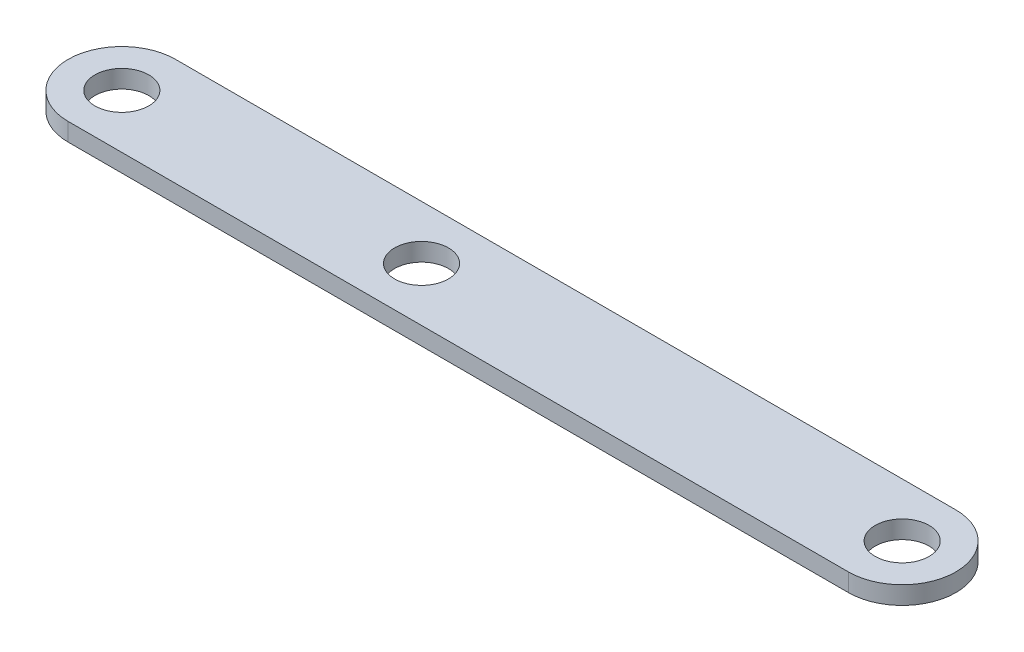
ISO-10303-21;
HEADER;
FILE_DESCRIPTION(('STEP AP214'),'2;1');
FILE_NAME('part.step','',(''),(''),'','','');
FILE_SCHEMA(('AUTOMOTIVE_DESIGN { 1 0 10303 214 1 1 1 1 }'));
ENDSEC;
DATA;
#1=APPLICATION_CONTEXT('core data for automotive mechanical design processes');
#2=APPLICATION_PROTOCOL_DEFINITION('international standard','automotive_design',2000,#1);
#3=PRODUCT_CONTEXT('',#1,'mechanical');
#4=PRODUCT('Part','Part','',(#3));
#5=PRODUCT_RELATED_PRODUCT_CATEGORY('part','',(#4));
#6=PRODUCT_DEFINITION_FORMATION('','',#4);
#7=PRODUCT_DEFINITION_CONTEXT('part definition',#1,'design');
#8=PRODUCT_DEFINITION('design','',#6,#7);
#9=PRODUCT_DEFINITION_SHAPE('','',#8);
#10=(LENGTH_UNIT() NAMED_UNIT(*) SI_UNIT(.MILLI.,.METRE.));
#11=(NAMED_UNIT(*) PLANE_ANGLE_UNIT() SI_UNIT($,.RADIAN.));
#12=(NAMED_UNIT(*) SI_UNIT($,.STERADIAN.) SOLID_ANGLE_UNIT());
#13=UNCERTAINTY_MEASURE_WITH_UNIT(LENGTH_MEASURE(1.E-05),#10,'distance_accuracy_value','');
#14=(GEOMETRIC_REPRESENTATION_CONTEXT(3) GLOBAL_UNCERTAINTY_ASSIGNED_CONTEXT((#13)) GLOBAL_UNIT_ASSIGNED_CONTEXT((#10,
#11,#12)) REPRESENTATION_CONTEXT('',''));
#15=CARTESIAN_POINT('',(0.,0.,0.));
#16=DIRECTION('',(0.,0.,1.));
#17=DIRECTION('',(1.,0.,0.));
#18=AXIS2_PLACEMENT_3D('',#15,#16,#17);
#19=CARTESIAN_POINT('',(0.,3.175,-9.5));
#20=DIRECTION('',(0.,1.,0.));
#21=DIRECTION('',(0.,0.,1.));
#22=AXIS2_PLACEMENT_3D('',#19,#20,#21);
#23=PLANE('',#22);
#24=CARTESIAN_POINT('',(138.,3.175,-9.5));
#25=DIRECTION('',(0.,1.,0.));
#26=DIRECTION('',(0.,0.,1.));
#27=AXIS2_PLACEMENT_3D('',#24,#25,#26);
#28=CIRCLE('',#27,4.76250000000001);
#29=CARTESIAN_POINT('',(138.,3.175,-4.73749999999999));
#30=VERTEX_POINT('',#29);
#31=EDGE_CURVE('E115',#30,#30,#28,.T.);
#32=ORIENTED_EDGE('',*,*,#31,.F.);
#33=EDGE_LOOP('',(#32));
#34=FACE_BOUND('',#33,.T.);
#35=CARTESIAN_POINT('',(0.,3.175,-9.5));
#36=DIRECTION('',(0.,1.,0.));
#37=DIRECTION('',(0.,0.,1.));
#38=AXIS2_PLACEMENT_3D('',#35,#36,#37);
#39=CIRCLE('',#38,9.5);
#40=CARTESIAN_POINT('',(0.,3.175,-19.));
#41=VERTEX_POINT('',#40);
#42=CARTESIAN_POINT('',(0.,3.175,0.));
#43=VERTEX_POINT('',#42);
#44=EDGE_CURVE('E85',#41,#43,#39,.T.);
#45=ORIENTED_EDGE('',*,*,#44,.T.);
#46=DIRECTION('',(1.,0.,0.));
#47=VECTOR('',#46,1.);
#48=CARTESIAN_POINT('',(0.,3.175,0.));
#49=LINE('',#48,#47);
#50=CARTESIAN_POINT('',(138.,3.175,0.));
#51=VERTEX_POINT('',#50);
#52=EDGE_CURVE('E80',#43,#51,#49,.T.);
#53=ORIENTED_EDGE('',*,*,#52,.T.);
#54=CARTESIAN_POINT('',(138.,3.175,-9.5));
#55=DIRECTION('',(0.,1.,0.));
#56=DIRECTION('',(0.,0.,1.));
#57=AXIS2_PLACEMENT_3D('',#54,#55,#56);
#58=CIRCLE('',#57,9.5);
#59=CARTESIAN_POINT('',(138.,3.175,-19.));
#60=VERTEX_POINT('',#59);
#61=EDGE_CURVE('E83',#51,#60,#58,.T.);
#62=ORIENTED_EDGE('',*,*,#61,.T.);
#63=DIRECTION('',(-1.,0.,0.));
#64=VECTOR('',#63,1.);
#65=CARTESIAN_POINT('',(0.,3.175,-19.));
#66=LINE('',#65,#64);
#67=EDGE_CURVE('E50',#60,#41,#66,.T.);
#68=ORIENTED_EDGE('',*,*,#67,.T.);
#69=EDGE_LOOP('',(#45,#53,#62,#68));
#70=FACE_BOUND('',#69,.T.);
#71=CARTESIAN_POINT('',(0.,3.175,-9.5));
#72=DIRECTION('',(0.,1.,0.));
#73=DIRECTION('',(0.,0.,1.));
#74=AXIS2_PLACEMENT_3D('',#71,#72,#73);
#75=CIRCLE('',#74,4.7625);
#76=CARTESIAN_POINT('',(0.,3.175,-4.7375));
#77=VERTEX_POINT('',#76);
#78=EDGE_CURVE('E100',#77,#77,#75,.T.);
#79=ORIENTED_EDGE('',*,*,#78,.F.);
#80=EDGE_LOOP('',(#79));
#81=FACE_BOUND('',#80,.T.);
#82=CARTESIAN_POINT('',(53.,3.175,-9.5));
#83=DIRECTION('',(0.,1.,0.));
#84=DIRECTION('',(0.,0.,1.));
#85=AXIS2_PLACEMENT_3D('',#82,#83,#84);
#86=CIRCLE('',#85,4.7625);
#87=CARTESIAN_POINT('',(53.,3.175,-4.7375));
#88=VERTEX_POINT('',#87);
#89=EDGE_CURVE('E121',#88,#88,#86,.T.);
#90=ORIENTED_EDGE('',*,*,#89,.F.);
#91=EDGE_LOOP('',(#90));
#92=FACE_BOUND('',#91,.T.);
#93=ADVANCED_FACE('F33',(#34,#70,#81,#92),#23,.T.);
#94=CARTESIAN_POINT('',(0.,0.,-9.5));
#95=DIRECTION('',(0.,1.,0.));
#96=DIRECTION('',(0.,0.,1.));
#97=AXIS2_PLACEMENT_3D('',#94,#95,#96);
#98=PLANE('',#97);
#99=CARTESIAN_POINT('',(0.,0.,-9.5));
#100=DIRECTION('',(0.,1.,0.));
#101=DIRECTION('',(0.,0.,1.));
#102=AXIS2_PLACEMENT_3D('',#99,#100,#101);
#103=CIRCLE('',#102,9.5);
#104=CARTESIAN_POINT('',(0.,0.,-19.));
#105=VERTEX_POINT('',#104);
#106=CARTESIAN_POINT('',(0.,0.,0.));
#107=VERTEX_POINT('',#106);
#108=EDGE_CURVE('E97',#105,#107,#103,.T.);
#109=ORIENTED_EDGE('',*,*,#108,.F.);
#110=DIRECTION('',(-1.,0.,0.));
#111=VECTOR('',#110,1.);
#112=CARTESIAN_POINT('',(0.,0.,-19.));
#113=LINE('',#112,#111);
#114=CARTESIAN_POINT('',(138.,0.,-19.));
#115=VERTEX_POINT('',#114);
#116=EDGE_CURVE('E73',#115,#105,#113,.T.);
#117=ORIENTED_EDGE('',*,*,#116,.F.);
#118=CARTESIAN_POINT('',(138.,0.,-9.5));
#119=DIRECTION('',(0.,1.,0.));
#120=DIRECTION('',(0.,0.,1.));
#121=AXIS2_PLACEMENT_3D('',#118,#119,#120);
#122=CIRCLE('',#121,9.5);
#123=CARTESIAN_POINT('',(138.,0.,0.));
#124=VERTEX_POINT('',#123);
#125=EDGE_CURVE('E67',#124,#115,#122,.T.);
#126=ORIENTED_EDGE('',*,*,#125,.F.);
#127=DIRECTION('',(1.,0.,0.));
#128=VECTOR('',#127,1.);
#129=CARTESIAN_POINT('',(0.,0.,0.));
#130=LINE('',#129,#128);
#131=EDGE_CURVE('E89',#107,#124,#130,.T.);
#132=ORIENTED_EDGE('',*,*,#131,.F.);
#133=EDGE_LOOP('',(#109,#117,#126,#132));
#134=FACE_BOUND('',#133,.T.);
#135=CARTESIAN_POINT('',(0.,0.,-9.5));
#136=DIRECTION('',(0.,1.,0.));
#137=DIRECTION('',(0.,0.,1.));
#138=AXIS2_PLACEMENT_3D('',#135,#136,#137);
#139=CIRCLE('',#138,4.7625);
#140=CARTESIAN_POINT('',(0.,0.,-4.7375));
#141=VERTEX_POINT('',#140);
#142=EDGE_CURVE('E112',#141,#141,#139,.T.);
#143=ORIENTED_EDGE('',*,*,#142,.T.);
#144=EDGE_LOOP('',(#143));
#145=FACE_BOUND('',#144,.T.);
#146=CARTESIAN_POINT('',(138.,0.,-9.5));
#147=DIRECTION('',(0.,1.,0.));
#148=DIRECTION('',(0.,0.,1.));
#149=AXIS2_PLACEMENT_3D('',#146,#147,#148);
#150=CIRCLE('',#149,4.76250000000001);
#151=CARTESIAN_POINT('',(138.,0.,-4.73749999999999));
#152=VERTEX_POINT('',#151);
#153=EDGE_CURVE('E118',#152,#152,#150,.T.);
#154=ORIENTED_EDGE('',*,*,#153,.T.);
#155=EDGE_LOOP('',(#154));
#156=FACE_BOUND('',#155,.T.);
#157=CARTESIAN_POINT('',(53.,0.,-9.5));
#158=DIRECTION('',(0.,1.,0.));
#159=DIRECTION('',(0.,0.,1.));
#160=AXIS2_PLACEMENT_3D('',#157,#158,#159);
#161=CIRCLE('',#160,4.7625);
#162=CARTESIAN_POINT('',(53.,0.,-4.7375));
#163=VERTEX_POINT('',#162);
#164=EDGE_CURVE('E124',#163,#163,#161,.T.);
#165=ORIENTED_EDGE('',*,*,#164,.T.);
#166=EDGE_LOOP('',(#165));
#167=FACE_BOUND('',#166,.T.);
#168=ADVANCED_FACE('F108',(#134,#145,#156,#167),#98,.F.);
#169=CARTESIAN_POINT('',(0.,3.175,-9.5));
#170=DIRECTION('',(0.,-1.,0.));
#171=DIRECTION('',(0.,0.,-1.));
#172=AXIS2_PLACEMENT_3D('',#169,#170,#171);
#173=CYLINDRICAL_SURFACE('',#172,9.5);
#174=ORIENTED_EDGE('',*,*,#108,.T.);
#175=DIRECTION('',(0.,-1.,0.));
#176=VECTOR('',#175,1.);
#177=CARTESIAN_POINT('',(0.,3.175,0.));
#178=LINE('',#177,#176);
#179=EDGE_CURVE('E11',#43,#107,#178,.T.);
#180=ORIENTED_EDGE('',*,*,#179,.F.);
#181=ORIENTED_EDGE('',*,*,#44,.F.);
#182=DIRECTION('',(0.,-1.,0.));
#183=VECTOR('',#182,1.);
#184=CARTESIAN_POINT('',(0.,3.175,-19.));
#185=LINE('',#184,#183);
#186=EDGE_CURVE('E93',#41,#105,#185,.T.);
#187=ORIENTED_EDGE('',*,*,#186,.T.);
#188=EDGE_LOOP('',(#174,#180,#181,#187));
#189=FACE_BOUND('',#188,.T.);
#190=ADVANCED_FACE('F35',(#189),#173,.T.);
#191=CARTESIAN_POINT('',(0.,3.175,0.));
#192=DIRECTION('',(0.,0.,-1.));
#193=DIRECTION('',(-1.,0.,0.));
#194=AXIS2_PLACEMENT_3D('',#191,#192,#193);
#195=PLANE('',#194);
#196=ORIENTED_EDGE('',*,*,#131,.T.);
#197=DIRECTION('',(0.,-1.,0.));
#198=VECTOR('',#197,1.);
#199=CARTESIAN_POINT('',(138.,3.175,0.));
#200=LINE('',#199,#198);
#201=EDGE_CURVE('E42',#51,#124,#200,.T.);
#202=ORIENTED_EDGE('',*,*,#201,.F.);
#203=ORIENTED_EDGE('',*,*,#52,.F.);
#204=ORIENTED_EDGE('',*,*,#179,.T.);
#205=EDGE_LOOP('',(#196,#202,#203,#204));
#206=FACE_BOUND('',#205,.T.);
#207=ADVANCED_FACE('F88',(#206),#195,.F.);
#208=CARTESIAN_POINT('',(138.,3.175,-9.5));
#209=DIRECTION('',(0.,-1.,0.));
#210=DIRECTION('',(0.,0.,-1.));
#211=AXIS2_PLACEMENT_3D('',#208,#209,#210);
#212=CYLINDRICAL_SURFACE('',#211,9.5);
#213=ORIENTED_EDGE('',*,*,#125,.T.);
#214=DIRECTION('',(0.,-1.,0.));
#215=VECTOR('',#214,1.);
#216=CARTESIAN_POINT('',(138.,3.175,-19.));
#217=LINE('',#216,#215);
#218=EDGE_CURVE('E90',#60,#115,#217,.T.);
#219=ORIENTED_EDGE('',*,*,#218,.F.);
#220=ORIENTED_EDGE('',*,*,#61,.F.);
#221=ORIENTED_EDGE('',*,*,#201,.T.);
#222=EDGE_LOOP('',(#213,#219,#220,#221));
#223=FACE_BOUND('',#222,.T.);
#224=ADVANCED_FACE('F91',(#223),#212,.T.);
#225=CARTESIAN_POINT('',(0.,3.175,-19.));
#226=DIRECTION('',(0.,0.,1.));
#227=DIRECTION('',(1.,0.,0.));
#228=AXIS2_PLACEMENT_3D('',#225,#226,#227);
#229=PLANE('',#228);
#230=ORIENTED_EDGE('',*,*,#116,.T.);
#231=ORIENTED_EDGE('',*,*,#186,.F.);
#232=ORIENTED_EDGE('',*,*,#67,.F.);
#233=ORIENTED_EDGE('',*,*,#218,.T.);
#234=EDGE_LOOP('',(#230,#231,#232,#233));
#235=FACE_BOUND('',#234,.T.);
#236=ADVANCED_FACE('F105',(#235),#229,.F.);
#237=CARTESIAN_POINT('',(0.,3.175,-9.5));
#238=DIRECTION('',(0.,-1.,0.));
#239=DIRECTION('',(0.,0.,-1.));
#240=AXIS2_PLACEMENT_3D('',#237,#238,#239);
#241=CYLINDRICAL_SURFACE('',#240,4.7625);
#242=ORIENTED_EDGE('',*,*,#78,.T.);
#243=EDGE_LOOP('',(#242));
#244=FACE_BOUND('',#243,.T.);
#245=ORIENTED_EDGE('',*,*,#142,.F.);
#246=EDGE_LOOP('',(#245));
#247=FACE_BOUND('',#246,.T.);
#248=ADVANCED_FACE('F142',(#244,#247),#241,.F.);
#249=CARTESIAN_POINT('',(138.,3.175,-9.5));
#250=DIRECTION('',(0.,-1.,0.));
#251=DIRECTION('',(0.,0.,-1.));
#252=AXIS2_PLACEMENT_3D('',#249,#250,#251);
#253=CYLINDRICAL_SURFACE('',#252,4.76250000000001);
#254=ORIENTED_EDGE('',*,*,#31,.T.);
#255=EDGE_LOOP('',(#254));
#256=FACE_BOUND('',#255,.T.);
#257=ORIENTED_EDGE('',*,*,#153,.F.);
#258=EDGE_LOOP('',(#257));
#259=FACE_BOUND('',#258,.T.);
#260=ADVANCED_FACE('F188',(#256,#259),#253,.F.);
#261=CARTESIAN_POINT('',(53.,3.175,-9.5));
#262=DIRECTION('',(0.,-1.,0.));
#263=DIRECTION('',(0.,0.,-1.));
#264=AXIS2_PLACEMENT_3D('',#261,#262,#263);
#265=CYLINDRICAL_SURFACE('',#264,4.7625);
#266=ORIENTED_EDGE('',*,*,#89,.T.);
#267=EDGE_LOOP('',(#266));
#268=FACE_BOUND('',#267,.T.);
#269=ORIENTED_EDGE('',*,*,#164,.F.);
#270=EDGE_LOOP('',(#269));
#271=FACE_BOUND('',#270,.T.);
#272=ADVANCED_FACE('F130',(#268,#271),#265,.F.);
#273=CLOSED_SHELL('',(#93,#168,#190,#207,#224,#236,#248,#260,#272));
#274=MANIFOLD_SOLID_BREP('B2',#273);
#275=ADVANCED_BREP_SHAPE_REPRESENTATION('',(#18,#274),#14);
#276=SHAPE_DEFINITION_REPRESENTATION(#9,#275);
ENDSEC;
END-ISO-10303-21;
